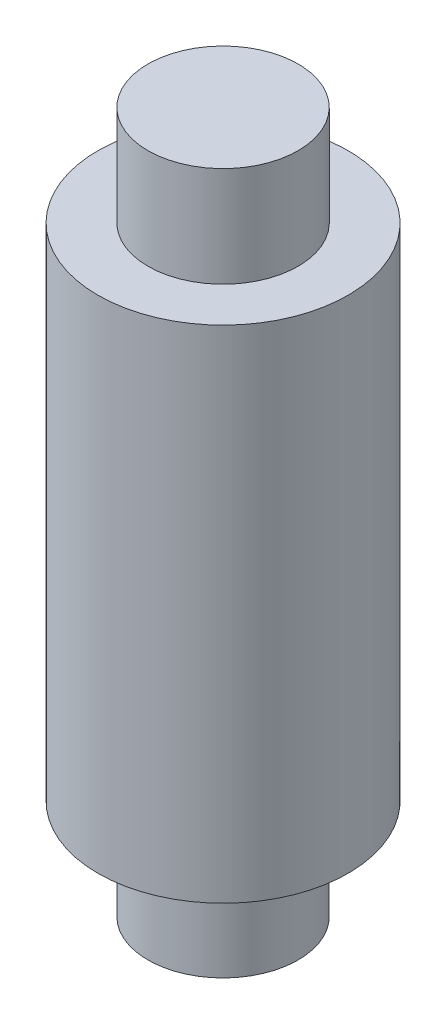
ISO-10303-21;
HEADER;
FILE_DESCRIPTION(('STEP AP214'),'2;1');
FILE_NAME('part.step','',(''),(''),'','','');
FILE_SCHEMA(('AUTOMOTIVE_DESIGN { 1 0 10303 214 1 1 1 1 }'));
ENDSEC;
DATA;
#1=APPLICATION_CONTEXT('core data for automotive mechanical design processes');
#2=APPLICATION_PROTOCOL_DEFINITION('international standard','automotive_design',2000,#1);
#3=PRODUCT_CONTEXT('',#1,'mechanical');
#4=PRODUCT('Part','Part','',(#3));
#5=PRODUCT_RELATED_PRODUCT_CATEGORY('part','',(#4));
#6=PRODUCT_DEFINITION_FORMATION('','',#4);
#7=PRODUCT_DEFINITION_CONTEXT('part definition',#1,'design');
#8=PRODUCT_DEFINITION('design','',#6,#7);
#9=PRODUCT_DEFINITION_SHAPE('','',#8);
#10=(LENGTH_UNIT() NAMED_UNIT(*) SI_UNIT(.MILLI.,.METRE.));
#11=(NAMED_UNIT(*) PLANE_ANGLE_UNIT() SI_UNIT($,.RADIAN.));
#12=(NAMED_UNIT(*) SI_UNIT($,.STERADIAN.) SOLID_ANGLE_UNIT());
#13=UNCERTAINTY_MEASURE_WITH_UNIT(LENGTH_MEASURE(1.E-05),#10,'distance_accuracy_value','');
#14=(GEOMETRIC_REPRESENTATION_CONTEXT(3) GLOBAL_UNCERTAINTY_ASSIGNED_CONTEXT((#13)) GLOBAL_UNIT_ASSIGNED_CONTEXT((#10,
#11,#12)) REPRESENTATION_CONTEXT('',''));
#15=CARTESIAN_POINT('',(0.,0.,0.));
#16=DIRECTION('',(0.,0.,1.));
#17=DIRECTION('',(1.,0.,0.));
#18=AXIS2_PLACEMENT_3D('',#15,#16,#17);
#19=CARTESIAN_POINT('',(0.,10.,0.));
#20=DIRECTION('',(0.,-1.,0.));
#21=DIRECTION('',(0.,0.,-1.));
#22=AXIS2_PLACEMENT_3D('',#19,#20,#21);
#23=CYLINDRICAL_SURFACE('',#22,2.5);
#24=CARTESIAN_POINT('',(0.,10.,0.));
#25=DIRECTION('',(0.,1.,0.));
#26=DIRECTION('',(0.,0.,1.));
#27=AXIS2_PLACEMENT_3D('',#24,#25,#26);
#28=CIRCLE('',#27,2.5);
#29=CARTESIAN_POINT('',(0.,10.,2.5));
#30=VERTEX_POINT('',#29);
#31=EDGE_CURVE('E51',#30,#30,#28,.T.);
#32=ORIENTED_EDGE('',*,*,#31,.F.);
#33=EDGE_LOOP('',(#32));
#34=FACE_BOUND('',#33,.T.);
#35=CARTESIAN_POINT('',(0.,0.,0.));
#36=DIRECTION('',(0.,1.,0.));
#37=DIRECTION('',(0.,0.,1.));
#38=AXIS2_PLACEMENT_3D('',#35,#36,#37);
#39=CIRCLE('',#38,2.5);
#40=CARTESIAN_POINT('',(0.,0.,2.5));
#41=VERTEX_POINT('',#40);
#42=EDGE_CURVE('E40',#41,#41,#39,.T.);
#43=ORIENTED_EDGE('',*,*,#42,.T.);
#44=EDGE_LOOP('',(#43));
#45=FACE_BOUND('',#44,.T.);
#46=ADVANCED_FACE('F37',(#34,#45),#23,.T.);
#47=CARTESIAN_POINT('',(0.,10.,0.));
#48=DIRECTION('',(0.,1.,0.));
#49=DIRECTION('',(0.,0.,1.));
#50=AXIS2_PLACEMENT_3D('',#47,#48,#49);
#51=PLANE('',#50);
#52=CARTESIAN_POINT('',(0.,10.,0.));
#53=DIRECTION('',(0.,1.,0.));
#54=DIRECTION('',(0.,0.,1.));
#55=AXIS2_PLACEMENT_3D('',#52,#53,#54);
#56=CIRCLE('',#55,1.5);
#57=CARTESIAN_POINT('',(0.,10.,1.5));
#58=VERTEX_POINT('',#57);
#59=EDGE_CURVE('E45',#58,#58,#56,.T.);
#60=ORIENTED_EDGE('',*,*,#59,.F.);
#61=EDGE_LOOP('',(#60));
#62=FACE_BOUND('',#61,.T.);
#63=ORIENTED_EDGE('',*,*,#31,.T.);
#64=EDGE_LOOP('',(#63));
#65=FACE_BOUND('',#64,.T.);
#66=ADVANCED_FACE('F71',(#62,#65),#51,.T.);
#67=CARTESIAN_POINT('',(0.,0.,0.));
#68=DIRECTION('',(0.,1.,0.));
#69=DIRECTION('',(0.,0.,1.));
#70=AXIS2_PLACEMENT_3D('',#67,#68,#69);
#71=PLANE('',#70);
#72=CARTESIAN_POINT('',(0.,0.,0.));
#73=DIRECTION('',(0.,-1.,0.));
#74=DIRECTION('',(0.,0.,-1.));
#75=AXIS2_PLACEMENT_3D('',#72,#73,#74);
#76=CIRCLE('',#75,1.5);
#77=CARTESIAN_POINT('',(0.,0.,-1.5));
#78=VERTEX_POINT('',#77);
#79=EDGE_CURVE('E10',#78,#78,#76,.T.);
#80=ORIENTED_EDGE('',*,*,#79,.F.);
#81=EDGE_LOOP('',(#80));
#82=FACE_BOUND('',#81,.T.);
#83=ORIENTED_EDGE('',*,*,#42,.F.);
#84=EDGE_LOOP('',(#83));
#85=FACE_BOUND('',#84,.T.);
#86=ADVANCED_FACE('F68',(#82,#85),#71,.F.);
#87=CARTESIAN_POINT('',(0.,12.,0.));
#88=DIRECTION('',(0.,-1.,0.));
#89=DIRECTION('',(0.,0.,-1.));
#90=AXIS2_PLACEMENT_3D('',#87,#88,#89);
#91=CYLINDRICAL_SURFACE('',#90,1.5);
#92=CARTESIAN_POINT('',(0.,12.,0.));
#93=DIRECTION('',(0.,1.,0.));
#94=DIRECTION('',(0.,0.,1.));
#95=AXIS2_PLACEMENT_3D('',#92,#93,#94);
#96=CIRCLE('',#95,1.5);
#97=CARTESIAN_POINT('',(0.,12.,1.5));
#98=VERTEX_POINT('',#97);
#99=EDGE_CURVE('E56',#98,#98,#96,.T.);
#100=ORIENTED_EDGE('',*,*,#99,.F.);
#101=EDGE_LOOP('',(#100));
#102=FACE_BOUND('',#101,.T.);
#103=ORIENTED_EDGE('',*,*,#59,.T.);
#104=EDGE_LOOP('',(#103));
#105=FACE_BOUND('',#104,.T.);
#106=ADVANCED_FACE('F70',(#102,#105),#91,.T.);
#107=CARTESIAN_POINT('',(0.,12.,0.));
#108=DIRECTION('',(0.,1.,0.));
#109=DIRECTION('',(0.,0.,1.));
#110=AXIS2_PLACEMENT_3D('',#107,#108,#109);
#111=PLANE('',#110);
#112=ORIENTED_EDGE('',*,*,#99,.T.);
#113=EDGE_LOOP('',(#112));
#114=FACE_BOUND('',#113,.T.);
#115=ADVANCED_FACE('F77',(#114),#111,.T.);
#116=CARTESIAN_POINT('',(0.,-2.,0.));
#117=DIRECTION('',(0.,1.,0.));
#118=DIRECTION('',(0.,0.,1.));
#119=AXIS2_PLACEMENT_3D('',#116,#117,#118);
#120=CYLINDRICAL_SURFACE('',#119,1.5);
#121=CARTESIAN_POINT('',(0.,-2.,0.));
#122=DIRECTION('',(0.,-1.,0.));
#123=DIRECTION('',(0.,0.,-1.));
#124=AXIS2_PLACEMENT_3D('',#121,#122,#123);
#125=CIRCLE('',#124,1.5);
#126=CARTESIAN_POINT('',(0.,-2.,-1.5));
#127=VERTEX_POINT('',#126);
#128=EDGE_CURVE('E55',#127,#127,#125,.T.);
#129=ORIENTED_EDGE('',*,*,#128,.F.);
#130=EDGE_LOOP('',(#129));
#131=FACE_BOUND('',#130,.T.);
#132=ORIENTED_EDGE('',*,*,#79,.T.);
#133=EDGE_LOOP('',(#132));
#134=FACE_BOUND('',#133,.T.);
#135=ADVANCED_FACE('F105',(#131,#134),#120,.T.);
#136=CARTESIAN_POINT('',(0.,-2.,0.));
#137=DIRECTION('',(0.,-1.,0.));
#138=DIRECTION('',(0.,0.,-1.));
#139=AXIS2_PLACEMENT_3D('',#136,#137,#138);
#140=PLANE('',#139);
#141=ORIENTED_EDGE('',*,*,#128,.T.);
#142=EDGE_LOOP('',(#141));
#143=FACE_BOUND('',#142,.T.);
#144=ADVANCED_FACE('F119',(#143),#140,.T.);
#145=CLOSED_SHELL('',(#46,#66,#86,#106,#115,#135,#144));
#146=MANIFOLD_SOLID_BREP('B2',#145);
#147=ADVANCED_BREP_SHAPE_REPRESENTATION('',(#18,#146),#14);
#148=SHAPE_DEFINITION_REPRESENTATION(#9,#147);
ENDSEC;
END-ISO-10303-21;
